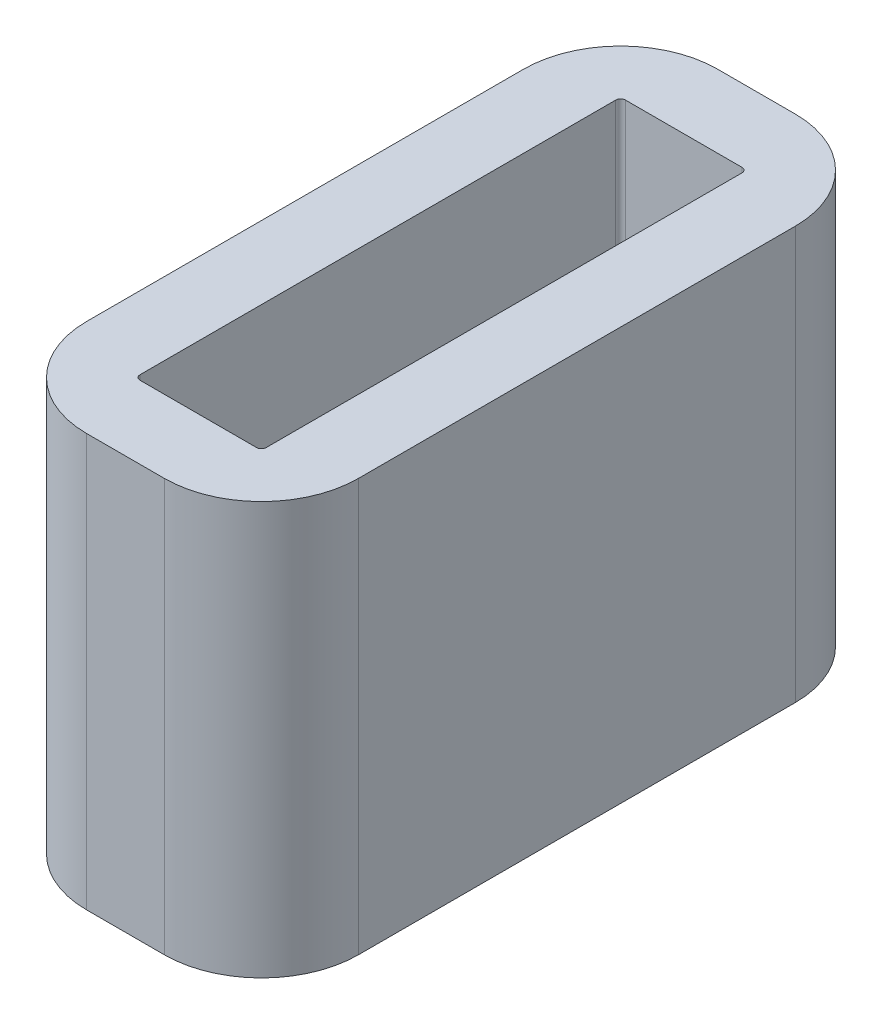
ISO-10303-21;
HEADER;
FILE_DESCRIPTION(('STEP AP214'),'2;1');
FILE_NAME('part.step','',(''),(''),'','','');
FILE_SCHEMA(('AUTOMOTIVE_DESIGN { 1 0 10303 214 1 1 1 1 }'));
ENDSEC;
DATA;
#1=APPLICATION_CONTEXT('core data for automotive mechanical design processes');
#2=APPLICATION_PROTOCOL_DEFINITION('international standard','automotive_design',2000,#1);
#3=PRODUCT_CONTEXT('',#1,'mechanical');
#4=PRODUCT('Part','Part','',(#3));
#5=PRODUCT_RELATED_PRODUCT_CATEGORY('part','',(#4));
#6=PRODUCT_DEFINITION_FORMATION('','',#4);
#7=PRODUCT_DEFINITION_CONTEXT('part definition',#1,'design');
#8=PRODUCT_DEFINITION('design','',#6,#7);
#9=PRODUCT_DEFINITION_SHAPE('','',#8);
#10=(LENGTH_UNIT() NAMED_UNIT(*) SI_UNIT(.MILLI.,.METRE.));
#11=(NAMED_UNIT(*) PLANE_ANGLE_UNIT() SI_UNIT($,.RADIAN.));
#12=(NAMED_UNIT(*) SI_UNIT($,.STERADIAN.) SOLID_ANGLE_UNIT());
#13=UNCERTAINTY_MEASURE_WITH_UNIT(LENGTH_MEASURE(1.E-05),#10,'distance_accuracy_value','');
#14=(GEOMETRIC_REPRESENTATION_CONTEXT(3) GLOBAL_UNCERTAINTY_ASSIGNED_CONTEXT((#13)) GLOBAL_UNIT_ASSIGNED_CONTEXT((#10,
#11,#12)) REPRESENTATION_CONTEXT('',''));
#15=CARTESIAN_POINT('',(0.,0.,0.));
#16=DIRECTION('',(0.,0.,1.));
#17=DIRECTION('',(1.,0.,0.));
#18=AXIS2_PLACEMENT_3D('',#15,#16,#17);
#19=CARTESIAN_POINT('',(88.2727928211845,88.0794752893805,-74.6093677585195));
#20=DIRECTION('',(0.,1.,0.));
#21=DIRECTION('',(0.,0.,1.));
#22=AXIS2_PLACEMENT_3D('',#19,#20,#21);
#23=CYLINDRICAL_SURFACE('',#22,1.99999999999999);
#24=CARTESIAN_POINT('',(88.2727928211845,96.5794752893805,-74.6093677585195));
#25=DIRECTION('',(0.,1.,0.));
#26=DIRECTION('',(0.,0.,-1.));
#27=AXIS2_PLACEMENT_3D('',#24,#25,#26);
#28=CIRCLE('',#27,1.99999999999999);
#29=CARTESIAN_POINT('',(86.2727928211845,96.5794752893805,-74.6093677585195));
#30=VERTEX_POINT('',#29);
#31=CARTESIAN_POINT('',(88.2727928211845,96.5794752893805,-72.6093677585195));
#32=VERTEX_POINT('',#31);
#33=EDGE_CURVE('E200',#30,#32,#28,.T.);
#34=ORIENTED_EDGE('',*,*,#33,.F.);
#35=DIRECTION('',(0.,1.,0.));
#36=VECTOR('',#35,1.);
#37=CARTESIAN_POINT('',(86.2727928211845,88.0794752893805,-74.6093677585195));
#38=LINE('',#37,#36);
#39=CARTESIAN_POINT('',(86.2727928211845,88.0794752893805,-74.6093677585195));
#40=VERTEX_POINT('',#39);
#41=EDGE_CURVE('E176',#40,#30,#38,.T.);
#42=ORIENTED_EDGE('',*,*,#41,.F.);
#43=CARTESIAN_POINT('',(88.2727928211845,88.0794752893805,-74.6093677585195));
#44=DIRECTION('',(0.,1.,0.));
#45=DIRECTION('',(0.,0.,-1.));
#46=AXIS2_PLACEMENT_3D('',#43,#44,#45);
#47=CIRCLE('',#46,1.99999999999999);
#48=CARTESIAN_POINT('',(88.2727928211845,88.0794752893805,-72.6093677585195));
#49=VERTEX_POINT('',#48);
#50=EDGE_CURVE('E170',#40,#49,#47,.T.);
#51=ORIENTED_EDGE('',*,*,#50,.T.);
#52=DIRECTION('',(0.,1.,0.));
#53=VECTOR('',#52,1.);
#54=CARTESIAN_POINT('',(88.2727928211845,88.0794752893805,-72.6093677585195));
#55=LINE('',#54,#53);
#56=EDGE_CURVE('E152',#49,#32,#55,.T.);
#57=ORIENTED_EDGE('',*,*,#56,.T.);
#58=EDGE_LOOP('',(#34,#42,#51,#57));
#59=FACE_BOUND('',#58,.T.);
#60=ADVANCED_FACE('F39',(#59),#23,.T.);
#61=CARTESIAN_POINT('',(86.2727928211845,88.0794752893805,-74.6093677585195));
#62=DIRECTION('',(-1.,0.,0.));
#63=DIRECTION('',(0.,0.,1.));
#64=AXIS2_PLACEMENT_3D('',#61,#62,#63);
#65=PLANE('',#64);
#66=DIRECTION('',(0.,0.,1.));
#67=VECTOR('',#66,1.);
#68=CARTESIAN_POINT('',(86.2727928211845,96.5794752893805,-74.6093677585195));
#69=LINE('',#68,#67);
#70=CARTESIAN_POINT('',(86.2727928211845,96.5794752893805,-83.6093677585195));
#71=VERTEX_POINT('',#70);
#72=EDGE_CURVE('E177',#71,#30,#69,.T.);
#73=ORIENTED_EDGE('',*,*,#72,.F.);
#74=DIRECTION('',(0.,1.,0.));
#75=VECTOR('',#74,1.);
#76=CARTESIAN_POINT('',(86.2727928211845,88.0794752893805,-83.6093677585195));
#77=LINE('',#76,#75);
#78=CARTESIAN_POINT('',(86.2727928211845,88.0794752893805,-83.6093677585195));
#79=VERTEX_POINT('',#78);
#80=EDGE_CURVE('E220',#79,#71,#77,.T.);
#81=ORIENTED_EDGE('',*,*,#80,.F.);
#82=DIRECTION('',(0.,0.,1.));
#83=VECTOR('',#82,1.);
#84=CARTESIAN_POINT('',(86.2727928211845,88.0794752893805,-74.6093677585195));
#85=LINE('',#84,#83);
#86=EDGE_CURVE('E163',#79,#40,#85,.T.);
#87=ORIENTED_EDGE('',*,*,#86,.T.);
#88=ORIENTED_EDGE('',*,*,#41,.T.);
#89=EDGE_LOOP('',(#73,#81,#87,#88));
#90=FACE_BOUND('',#89,.T.);
#91=ADVANCED_FACE('F320',(#90),#65,.T.);
#92=CARTESIAN_POINT('',(88.2727928211845,88.0794752893805,-83.6093677585195));
#93=DIRECTION('',(0.,1.,0.));
#94=DIRECTION('',(0.,0.,1.));
#95=AXIS2_PLACEMENT_3D('',#92,#93,#94);
#96=CYLINDRICAL_SURFACE('',#95,1.99999999999999);
#97=CARTESIAN_POINT('',(88.2727928211845,96.5794752893805,-83.6093677585195));
#98=DIRECTION('',(0.,1.,0.));
#99=DIRECTION('',(0.,0.,-1.));
#100=AXIS2_PLACEMENT_3D('',#97,#98,#99);
#101=CIRCLE('',#100,1.99999999999999);
#102=CARTESIAN_POINT('',(88.2727928211845,96.5794752893805,-85.6093677585195));
#103=VERTEX_POINT('',#102);
#104=EDGE_CURVE('E180',#103,#71,#101,.T.);
#105=ORIENTED_EDGE('',*,*,#104,.F.);
#106=DIRECTION('',(0.,1.,0.));
#107=VECTOR('',#106,1.);
#108=CARTESIAN_POINT('',(88.2727928211845,88.0794752893805,-85.6093677585195));
#109=LINE('',#108,#107);
#110=CARTESIAN_POINT('',(88.2727928211845,88.0794752893805,-85.6093677585195));
#111=VERTEX_POINT('',#110);
#112=EDGE_CURVE('E222',#111,#103,#109,.T.);
#113=ORIENTED_EDGE('',*,*,#112,.F.);
#114=CARTESIAN_POINT('',(88.2727928211845,88.0794752893805,-83.6093677585195));
#115=DIRECTION('',(0.,1.,0.));
#116=DIRECTION('',(0.,0.,-1.));
#117=AXIS2_PLACEMENT_3D('',#114,#115,#116);
#118=CIRCLE('',#117,1.99999999999999);
#119=EDGE_CURVE('E196',#111,#79,#118,.T.);
#120=ORIENTED_EDGE('',*,*,#119,.T.);
#121=ORIENTED_EDGE('',*,*,#80,.T.);
#122=EDGE_LOOP('',(#105,#113,#120,#121));
#123=FACE_BOUND('',#122,.T.);
#124=ADVANCED_FACE('F325',(#123),#96,.T.);
#125=CARTESIAN_POINT('',(88.2727928211845,88.0794752893805,-85.6093677585195));
#126=DIRECTION('',(0.,0.,-1.));
#127=DIRECTION('',(-1.,0.,0.));
#128=AXIS2_PLACEMENT_3D('',#125,#126,#127);
#129=PLANE('',#128);
#130=DIRECTION('',(-1.,0.,0.));
#131=VECTOR('',#130,1.);
#132=CARTESIAN_POINT('',(88.2727928211845,96.5794752893805,-85.6093677585195));
#133=LINE('',#132,#131);
#134=CARTESIAN_POINT('',(89.8727928211845,96.5794752893805,-85.6093677585195));
#135=VERTEX_POINT('',#134);
#136=EDGE_CURVE('E213',#135,#103,#133,.T.);
#137=ORIENTED_EDGE('',*,*,#136,.F.);
#138=DIRECTION('',(0.,1.,0.));
#139=VECTOR('',#138,1.);
#140=CARTESIAN_POINT('',(89.8727928211845,88.0794752893805,-85.6093677585195));
#141=LINE('',#140,#139);
#142=CARTESIAN_POINT('',(89.8727928211845,88.0794752893805,-85.6093677585195));
#143=VERTEX_POINT('',#142);
#144=EDGE_CURVE('E224',#143,#135,#141,.T.);
#145=ORIENTED_EDGE('',*,*,#144,.F.);
#146=DIRECTION('',(-1.,0.,0.));
#147=VECTOR('',#146,1.);
#148=CARTESIAN_POINT('',(88.2727928211845,88.0794752893805,-85.6093677585195));
#149=LINE('',#148,#147);
#150=EDGE_CURVE('E193',#143,#111,#149,.T.);
#151=ORIENTED_EDGE('',*,*,#150,.T.);
#152=ORIENTED_EDGE('',*,*,#112,.T.);
#153=EDGE_LOOP('',(#137,#145,#151,#152));
#154=FACE_BOUND('',#153,.T.);
#155=ADVANCED_FACE('F433',(#154),#129,.T.);
#156=CARTESIAN_POINT('',(89.8727928211845,88.0794752893805,-83.6093677585195));
#157=DIRECTION('',(0.,1.,0.));
#158=DIRECTION('',(0.,0.,1.));
#159=AXIS2_PLACEMENT_3D('',#156,#157,#158);
#160=CYLINDRICAL_SURFACE('',#159,1.99999999999999);
#161=CARTESIAN_POINT('',(89.8727928211845,96.5794752893805,-83.6093677585195));
#162=DIRECTION('',(0.,1.,0.));
#163=DIRECTION('',(0.,0.,-1.));
#164=AXIS2_PLACEMENT_3D('',#161,#162,#163);
#165=CIRCLE('',#164,1.99999999999999);
#166=CARTESIAN_POINT('',(91.8727928211845,96.5794752893805,-83.6093677585195));
#167=VERTEX_POINT('',#166);
#168=EDGE_CURVE('E210',#167,#135,#165,.T.);
#169=ORIENTED_EDGE('',*,*,#168,.F.);
#170=DIRECTION('',(0.,1.,0.));
#171=VECTOR('',#170,1.);
#172=CARTESIAN_POINT('',(91.8727928211845,88.0794752893805,-83.6093677585195));
#173=LINE('',#172,#171);
#174=CARTESIAN_POINT('',(91.8727928211845,88.0794752893805,-83.6093677585195));
#175=VERTEX_POINT('',#174);
#176=EDGE_CURVE('E226',#175,#167,#173,.T.);
#177=ORIENTED_EDGE('',*,*,#176,.F.);
#178=CARTESIAN_POINT('',(89.8727928211845,88.0794752893805,-83.6093677585195));
#179=DIRECTION('',(0.,1.,0.));
#180=DIRECTION('',(0.,0.,-1.));
#181=AXIS2_PLACEMENT_3D('',#178,#179,#180);
#182=CIRCLE('',#181,1.99999999999999);
#183=EDGE_CURVE('E190',#175,#143,#182,.T.);
#184=ORIENTED_EDGE('',*,*,#183,.T.);
#185=ORIENTED_EDGE('',*,*,#144,.T.);
#186=EDGE_LOOP('',(#169,#177,#184,#185));
#187=FACE_BOUND('',#186,.T.);
#188=ADVANCED_FACE('F423',(#187),#160,.T.);
#189=CARTESIAN_POINT('',(91.8727928211845,88.0794752893805,-74.6093677585195));
#190=DIRECTION('',(1.,0.,0.));
#191=DIRECTION('',(0.,0.,-1.));
#192=AXIS2_PLACEMENT_3D('',#189,#190,#191);
#193=PLANE('',#192);
#194=DIRECTION('',(0.,0.,-1.));
#195=VECTOR('',#194,1.);
#196=CARTESIAN_POINT('',(91.8727928211845,96.5794752893805,-74.6093677585195));
#197=LINE('',#196,#195);
#198=CARTESIAN_POINT('',(91.8727928211845,96.5794752893805,-74.6093677585195));
#199=VERTEX_POINT('',#198);
#200=EDGE_CURVE('E207',#199,#167,#197,.T.);
#201=ORIENTED_EDGE('',*,*,#200,.F.);
#202=DIRECTION('',(0.,1.,0.));
#203=VECTOR('',#202,1.);
#204=CARTESIAN_POINT('',(91.8727928211845,88.0794752893805,-74.6093677585195));
#205=LINE('',#204,#203);
#206=CARTESIAN_POINT('',(91.8727928211845,88.0794752893805,-74.6093677585195));
#207=VERTEX_POINT('',#206);
#208=EDGE_CURVE('E228',#207,#199,#205,.T.);
#209=ORIENTED_EDGE('',*,*,#208,.F.);
#210=DIRECTION('',(0.,0.,-1.));
#211=VECTOR('',#210,1.);
#212=CARTESIAN_POINT('',(91.8727928211845,88.0794752893805,-74.6093677585195));
#213=LINE('',#212,#211);
#214=EDGE_CURVE('E187',#207,#175,#213,.T.);
#215=ORIENTED_EDGE('',*,*,#214,.T.);
#216=ORIENTED_EDGE('',*,*,#176,.T.);
#217=EDGE_LOOP('',(#201,#209,#215,#216));
#218=FACE_BOUND('',#217,.T.);
#219=ADVANCED_FACE('F414',(#218),#193,.T.);
#220=CARTESIAN_POINT('',(89.8727928211845,88.0794752893805,-74.6093677585195));
#221=DIRECTION('',(0.,1.,0.));
#222=DIRECTION('',(0.,0.,1.));
#223=AXIS2_PLACEMENT_3D('',#220,#221,#222);
#224=CYLINDRICAL_SURFACE('',#223,1.99999999999999);
#225=CARTESIAN_POINT('',(89.8727928211845,96.5794752893805,-74.6093677585195));
#226=DIRECTION('',(0.,1.,0.));
#227=DIRECTION('',(0.,0.,1.));
#228=AXIS2_PLACEMENT_3D('',#225,#226,#227);
#229=CIRCLE('',#228,1.99999999999999);
#230=CARTESIAN_POINT('',(89.8727928211845,96.5794752893805,-72.6093677585195));
#231=VERTEX_POINT('',#230);
#232=EDGE_CURVE('E204',#231,#199,#229,.T.);
#233=ORIENTED_EDGE('',*,*,#232,.F.);
#234=DIRECTION('',(0.,1.,0.));
#235=VECTOR('',#234,1.);
#236=CARTESIAN_POINT('',(89.8727928211845,88.0794752893805,-72.6093677585195));
#237=LINE('',#236,#235);
#238=CARTESIAN_POINT('',(89.8727928211845,88.0794752893805,-72.6093677585195));
#239=VERTEX_POINT('',#238);
#240=EDGE_CURVE('E162',#239,#231,#237,.T.);
#241=ORIENTED_EDGE('',*,*,#240,.F.);
#242=CARTESIAN_POINT('',(89.8727928211845,88.0794752893805,-74.6093677585195));
#243=DIRECTION('',(0.,1.,0.));
#244=DIRECTION('',(0.,0.,1.));
#245=AXIS2_PLACEMENT_3D('',#242,#243,#244);
#246=CIRCLE('',#245,1.99999999999999);
#247=EDGE_CURVE('E174',#239,#207,#246,.T.);
#248=ORIENTED_EDGE('',*,*,#247,.T.);
#249=ORIENTED_EDGE('',*,*,#208,.T.);
#250=EDGE_LOOP('',(#233,#241,#248,#249));
#251=FACE_BOUND('',#250,.T.);
#252=ADVANCED_FACE('F406',(#251),#224,.T.);
#253=CARTESIAN_POINT('',(88.2727928211845,88.0794752893805,-72.6093677585195));
#254=DIRECTION('',(0.,0.,1.));
#255=DIRECTION('',(1.,0.,0.));
#256=AXIS2_PLACEMENT_3D('',#253,#254,#255);
#257=PLANE('',#256);
#258=DIRECTION('',(1.,0.,0.));
#259=VECTOR('',#258,1.);
#260=CARTESIAN_POINT('',(88.2727928211845,96.5794752893805,-72.6093677585195));
#261=LINE('',#260,#259);
#262=EDGE_CURVE('E157',#32,#231,#261,.T.);
#263=ORIENTED_EDGE('',*,*,#262,.F.);
#264=ORIENTED_EDGE('',*,*,#56,.F.);
#265=DIRECTION('',(1.,0.,0.));
#266=VECTOR('',#265,1.);
#267=CARTESIAN_POINT('',(88.2727928211845,88.0794752893805,-72.6093677585195));
#268=LINE('',#267,#266);
#269=EDGE_CURVE('E155',#49,#239,#268,.T.);
#270=ORIENTED_EDGE('',*,*,#269,.T.);
#271=ORIENTED_EDGE('',*,*,#240,.T.);
#272=EDGE_LOOP('',(#263,#264,#270,#271));
#273=FACE_BOUND('',#272,.T.);
#274=ADVANCED_FACE('F154',(#273),#257,.T.);
#275=CARTESIAN_POINT('',(88.2727928211845,88.0794752893805,-74.6093677585195));
#276=DIRECTION('',(0.,-1.,0.));
#277=DIRECTION('',(0.,0.,-1.));
#278=AXIS2_PLACEMENT_3D('',#275,#276,#277);
#279=PLANE('',#278);
#280=DIRECTION('',(1.,0.,0.));
#281=VECTOR('',#280,1.);
#282=CARTESIAN_POINT('',(87.7727928211845,88.0794752893805,-74.1093677585195));
#283=LINE('',#282,#281);
#284=CARTESIAN_POINT('',(87.8727928211845,88.0794752893805,-74.1093677585195));
#285=VERTEX_POINT('',#284);
#286=CARTESIAN_POINT('',(90.2727928211845,88.0794752893805,-74.1093677585195));
#287=VERTEX_POINT('',#286);
#288=EDGE_CURVE('E202',#285,#287,#283,.T.);
#289=ORIENTED_EDGE('',*,*,#288,.T.);
#290=CARTESIAN_POINT('',(90.2727928211845,88.0794752893805,-74.2093677585195));
#291=DIRECTION('',(0.,-1.,0.));
#292=DIRECTION('',(0.,0.,-1.));
#293=AXIS2_PLACEMENT_3D('',#290,#291,#292);
#294=CIRCLE('',#293,0.1);
#295=CARTESIAN_POINT('',(90.3727928211845,88.0794752893805,-74.2093677585195));
#296=VERTEX_POINT('',#295);
#297=EDGE_CURVE('E251',#287,#296,#294,.F.);
#298=ORIENTED_EDGE('',*,*,#297,.T.);
#299=DIRECTION('',(0.,0.,-1.));
#300=VECTOR('',#299,1.);
#301=CARTESIAN_POINT('',(90.3727928211845,88.0794752893805,-74.1093677585195));
#302=LINE('',#301,#300);
#303=CARTESIAN_POINT('',(90.3727928211845,88.0794752893805,-84.0093677585195));
#304=VERTEX_POINT('',#303);
#305=EDGE_CURVE('E280',#296,#304,#302,.T.);
#306=ORIENTED_EDGE('',*,*,#305,.T.);
#307=CARTESIAN_POINT('',(90.2727928211845,88.0794752893805,-84.0093677585195));
#308=DIRECTION('',(0.,-1.,0.));
#309=DIRECTION('',(0.,0.,-1.));
#310=AXIS2_PLACEMENT_3D('',#307,#308,#309);
#311=CIRCLE('',#310,0.1);
#312=CARTESIAN_POINT('',(90.2727928211845,88.0794752893805,-84.1093677585195));
#313=VERTEX_POINT('',#312);
#314=EDGE_CURVE('E11',#304,#313,#311,.F.);
#315=ORIENTED_EDGE('',*,*,#314,.T.);
#316=DIRECTION('',(-1.,0.,0.));
#317=VECTOR('',#316,1.);
#318=CARTESIAN_POINT('',(87.7727928211845,88.0794752893805,-84.1093677585195));
#319=LINE('',#318,#317);
#320=CARTESIAN_POINT('',(87.8727928211845,88.0794752893805,-84.1093677585195));
#321=VERTEX_POINT('',#320);
#322=EDGE_CURVE('E277',#313,#321,#319,.T.);
#323=ORIENTED_EDGE('',*,*,#322,.T.);
#324=CARTESIAN_POINT('',(87.8727928211845,88.0794752893805,-84.0093677585195));
#325=DIRECTION('',(0.,-1.,0.));
#326=DIRECTION('',(0.,0.,-1.));
#327=AXIS2_PLACEMENT_3D('',#324,#325,#326);
#328=CIRCLE('',#327,0.1);
#329=CARTESIAN_POINT('',(87.7727928211845,88.0794752893805,-84.0093677585195));
#330=VERTEX_POINT('',#329);
#331=EDGE_CURVE('E259',#321,#330,#328,.F.);
#332=ORIENTED_EDGE('',*,*,#331,.T.);
#333=DIRECTION('',(0.,0.,1.));
#334=VECTOR('',#333,1.);
#335=CARTESIAN_POINT('',(87.7727928211845,88.0794752893805,-74.1093677585195));
#336=LINE('',#335,#334);
#337=CARTESIAN_POINT('',(87.7727928211845,88.0794752893805,-74.2093677585195));
#338=VERTEX_POINT('',#337);
#339=EDGE_CURVE('E279',#330,#338,#336,.T.);
#340=ORIENTED_EDGE('',*,*,#339,.T.);
#341=CARTESIAN_POINT('',(87.8727928211845,88.0794752893805,-74.2093677585195));
#342=DIRECTION('',(0.,-1.,0.));
#343=DIRECTION('',(0.,0.,-1.));
#344=AXIS2_PLACEMENT_3D('',#341,#342,#343);
#345=CIRCLE('',#344,0.1);
#346=EDGE_CURVE('E255',#338,#285,#345,.F.);
#347=ORIENTED_EDGE('',*,*,#346,.T.);
#348=EDGE_LOOP('',(#289,#298,#306,#315,#323,#332,#340,#347));
#349=FACE_BOUND('',#348,.T.);
#350=ORIENTED_EDGE('',*,*,#50,.F.);
#351=ORIENTED_EDGE('',*,*,#86,.F.);
#352=ORIENTED_EDGE('',*,*,#119,.F.);
#353=ORIENTED_EDGE('',*,*,#150,.F.);
#354=ORIENTED_EDGE('',*,*,#183,.F.);
#355=ORIENTED_EDGE('',*,*,#214,.F.);
#356=ORIENTED_EDGE('',*,*,#247,.F.);
#357=ORIENTED_EDGE('',*,*,#269,.F.);
#358=EDGE_LOOP('',(#350,#351,#352,#353,#354,#355,#356,#357));
#359=FACE_BOUND('',#358,.T.);
#360=ADVANCED_FACE('F168',(#349,#359),#279,.T.);
#361=CARTESIAN_POINT('',(88.2727928211845,96.5794752893805,-74.6093677585195));
#362=DIRECTION('',(0.,-1.,0.));
#363=DIRECTION('',(0.,0.,-1.));
#364=AXIS2_PLACEMENT_3D('',#361,#362,#363);
#365=PLANE('',#364);
#366=DIRECTION('',(-1.,0.,0.));
#367=VECTOR('',#366,1.);
#368=CARTESIAN_POINT('',(87.7727928211845,96.5794752893805,-84.1093677585195));
#369=LINE('',#368,#367);
#370=CARTESIAN_POINT('',(90.2727928211845,96.5794752893805,-84.1093677585195));
#371=VERTEX_POINT('',#370);
#372=CARTESIAN_POINT('',(87.8727928211845,96.5794752893805,-84.1093677585195));
#373=VERTEX_POINT('',#372);
#374=EDGE_CURVE('E267',#371,#373,#369,.T.);
#375=ORIENTED_EDGE('',*,*,#374,.F.);
#376=CARTESIAN_POINT('',(90.2727928211845,96.5794752893805,-84.0093677585195));
#377=DIRECTION('',(0.,-1.,0.));
#378=DIRECTION('',(0.,0.,-1.));
#379=AXIS2_PLACEMENT_3D('',#376,#377,#378);
#380=CIRCLE('',#379,0.1);
#381=CARTESIAN_POINT('',(90.3727928211845,96.5794752893805,-84.0093677585195));
#382=VERTEX_POINT('',#381);
#383=EDGE_CURVE('E47',#371,#382,#380,.T.);
#384=ORIENTED_EDGE('',*,*,#383,.T.);
#385=DIRECTION('',(0.,0.,-1.));
#386=VECTOR('',#385,1.);
#387=CARTESIAN_POINT('',(90.3727928211845,96.5794752893805,-74.1093677585195));
#388=LINE('',#387,#386);
#389=CARTESIAN_POINT('',(90.3727928211845,96.5794752893805,-74.2093677585195));
#390=VERTEX_POINT('',#389);
#391=EDGE_CURVE('E266',#390,#382,#388,.T.);
#392=ORIENTED_EDGE('',*,*,#391,.F.);
#393=CARTESIAN_POINT('',(90.2727928211845,96.5794752893805,-74.2093677585195));
#394=DIRECTION('',(0.,-1.,0.));
#395=DIRECTION('',(0.,0.,-1.));
#396=AXIS2_PLACEMENT_3D('',#393,#394,#395);
#397=CIRCLE('',#396,0.1);
#398=CARTESIAN_POINT('',(90.2727928211845,96.5794752893805,-74.1093677585195));
#399=VERTEX_POINT('',#398);
#400=EDGE_CURVE('E249',#390,#399,#397,.T.);
#401=ORIENTED_EDGE('',*,*,#400,.T.);
#402=DIRECTION('',(1.,0.,0.));
#403=VECTOR('',#402,1.);
#404=CARTESIAN_POINT('',(87.7727928211845,96.5794752893805,-74.1093677585195));
#405=LINE('',#404,#403);
#406=CARTESIAN_POINT('',(87.8727928211845,96.5794752893805,-74.1093677585195));
#407=VERTEX_POINT('',#406);
#408=EDGE_CURVE('E183',#407,#399,#405,.T.);
#409=ORIENTED_EDGE('',*,*,#408,.F.);
#410=CARTESIAN_POINT('',(87.8727928211845,96.5794752893805,-74.2093677585195));
#411=DIRECTION('',(0.,-1.,0.));
#412=DIRECTION('',(0.,0.,-1.));
#413=AXIS2_PLACEMENT_3D('',#410,#411,#412);
#414=CIRCLE('',#413,0.1);
#415=CARTESIAN_POINT('',(87.7727928211845,96.5794752893805,-74.2093677585195));
#416=VERTEX_POINT('',#415);
#417=EDGE_CURVE('E253',#407,#416,#414,.T.);
#418=ORIENTED_EDGE('',*,*,#417,.T.);
#419=DIRECTION('',(0.,0.,1.));
#420=VECTOR('',#419,1.);
#421=CARTESIAN_POINT('',(87.7727928211845,96.5794752893805,-74.1093677585195));
#422=LINE('',#421,#420);
#423=CARTESIAN_POINT('',(87.7727928211845,96.5794752893805,-84.0093677585195));
#424=VERTEX_POINT('',#423);
#425=EDGE_CURVE('E288',#424,#416,#422,.T.);
#426=ORIENTED_EDGE('',*,*,#425,.F.);
#427=CARTESIAN_POINT('',(87.8727928211845,96.5794752893805,-84.0093677585195));
#428=DIRECTION('',(0.,-1.,0.));
#429=DIRECTION('',(0.,0.,-1.));
#430=AXIS2_PLACEMENT_3D('',#427,#428,#429);
#431=CIRCLE('',#430,0.1);
#432=EDGE_CURVE('E257',#424,#373,#431,.T.);
#433=ORIENTED_EDGE('',*,*,#432,.T.);
#434=EDGE_LOOP('',(#375,#384,#392,#401,#409,#418,#426,#433));
#435=FACE_BOUND('',#434,.T.);
#436=ORIENTED_EDGE('',*,*,#33,.T.);
#437=ORIENTED_EDGE('',*,*,#262,.T.);
#438=ORIENTED_EDGE('',*,*,#232,.T.);
#439=ORIENTED_EDGE('',*,*,#200,.T.);
#440=ORIENTED_EDGE('',*,*,#168,.T.);
#441=ORIENTED_EDGE('',*,*,#136,.T.);
#442=ORIENTED_EDGE('',*,*,#104,.T.);
#443=ORIENTED_EDGE('',*,*,#72,.T.);
#444=EDGE_LOOP('',(#436,#437,#438,#439,#440,#441,#442,#443));
#445=FACE_BOUND('',#444,.T.);
#446=ADVANCED_FACE('F264',(#435,#445),#365,.F.);
#447=CARTESIAN_POINT('',(90.3727928211845,88.0794752893805,-74.1093677585195));
#448=DIRECTION('',(1.,0.,0.));
#449=DIRECTION('',(0.,0.,-1.));
#450=AXIS2_PLACEMENT_3D('',#447,#448,#449);
#451=PLANE('',#450);
#452=ORIENTED_EDGE('',*,*,#305,.F.);
#453=DIRECTION('',(0.,1.,0.));
#454=VECTOR('',#453,1.);
#455=CARTESIAN_POINT('',(90.3727928211845,96.5794752893805,-74.2093677585195));
#456=LINE('',#455,#454);
#457=EDGE_CURVE('E232',#296,#390,#456,.T.);
#458=ORIENTED_EDGE('',*,*,#457,.T.);
#459=ORIENTED_EDGE('',*,*,#391,.T.);
#460=DIRECTION('',(0.,1.,0.));
#461=VECTOR('',#460,1.);
#462=CARTESIAN_POINT('',(90.3727928211845,88.0794752893805,-84.0093677585195));
#463=LINE('',#462,#461);
#464=EDGE_CURVE('E219',#382,#304,#463,.F.);
#465=ORIENTED_EDGE('',*,*,#464,.T.);
#466=EDGE_LOOP('',(#452,#458,#459,#465));
#467=FACE_BOUND('',#466,.T.);
#468=ADVANCED_FACE('F273',(#467),#451,.F.);
#469=CARTESIAN_POINT('',(87.7727928211845,88.0794752893805,-74.1093677585195));
#470=DIRECTION('',(0.,0.,1.));
#471=DIRECTION('',(1.,0.,0.));
#472=AXIS2_PLACEMENT_3D('',#469,#470,#471);
#473=PLANE('',#472);
#474=ORIENTED_EDGE('',*,*,#408,.T.);
#475=DIRECTION('',(0.,1.,0.));
#476=VECTOR('',#475,1.);
#477=CARTESIAN_POINT('',(90.2727928211845,88.0794752893805,-74.1093677585195));
#478=LINE('',#477,#476);
#479=EDGE_CURVE('E238',#399,#287,#478,.F.);
#480=ORIENTED_EDGE('',*,*,#479,.T.);
#481=ORIENTED_EDGE('',*,*,#288,.F.);
#482=DIRECTION('',(0.,1.,0.));
#483=VECTOR('',#482,1.);
#484=CARTESIAN_POINT('',(87.8727928211845,96.5794752893805,-74.1093677585195));
#485=LINE('',#484,#483);
#486=EDGE_CURVE('E235',#285,#407,#485,.T.);
#487=ORIENTED_EDGE('',*,*,#486,.T.);
#488=EDGE_LOOP('',(#474,#480,#481,#487));
#489=FACE_BOUND('',#488,.T.);
#490=ADVANCED_FACE('F297',(#489),#473,.F.);
#491=CARTESIAN_POINT('',(87.7727928211845,88.0794752893805,-74.1093677585195));
#492=DIRECTION('',(-1.,0.,0.));
#493=DIRECTION('',(0.,0.,1.));
#494=AXIS2_PLACEMENT_3D('',#491,#492,#493);
#495=PLANE('',#494);
#496=ORIENTED_EDGE('',*,*,#425,.T.);
#497=DIRECTION('',(0.,1.,0.));
#498=VECTOR('',#497,1.);
#499=CARTESIAN_POINT('',(87.7727928211845,88.0794752893805,-74.2093677585195));
#500=LINE('',#499,#498);
#501=EDGE_CURVE('E243',#416,#338,#500,.F.);
#502=ORIENTED_EDGE('',*,*,#501,.T.);
#503=ORIENTED_EDGE('',*,*,#339,.F.);
#504=DIRECTION('',(0.,1.,0.));
#505=VECTOR('',#504,1.);
#506=CARTESIAN_POINT('',(87.7727928211845,96.5794752893805,-84.0093677585195));
#507=LINE('',#506,#505);
#508=EDGE_CURVE('E240',#330,#424,#507,.T.);
#509=ORIENTED_EDGE('',*,*,#508,.T.);
#510=EDGE_LOOP('',(#496,#502,#503,#509));
#511=FACE_BOUND('',#510,.T.);
#512=ADVANCED_FACE('F310',(#511),#495,.F.);
#513=CARTESIAN_POINT('',(87.7727928211845,88.0794752893805,-84.1093677585195));
#514=DIRECTION('',(0.,0.,-1.));
#515=DIRECTION('',(-1.,0.,0.));
#516=AXIS2_PLACEMENT_3D('',#513,#514,#515);
#517=PLANE('',#516);
#518=ORIENTED_EDGE('',*,*,#374,.T.);
#519=DIRECTION('',(0.,1.,0.));
#520=VECTOR('',#519,1.);
#521=CARTESIAN_POINT('',(87.8727928211845,88.0794752893805,-84.1093677585195));
#522=LINE('',#521,#520);
#523=EDGE_CURVE('E54',#373,#321,#522,.F.);
#524=ORIENTED_EDGE('',*,*,#523,.T.);
#525=ORIENTED_EDGE('',*,*,#322,.F.);
#526=DIRECTION('',(0.,1.,0.));
#527=VECTOR('',#526,1.);
#528=CARTESIAN_POINT('',(90.2727928211845,96.5794752893805,-84.1093677585195));
#529=LINE('',#528,#527);
#530=EDGE_CURVE('E245',#313,#371,#529,.T.);
#531=ORIENTED_EDGE('',*,*,#530,.T.);
#532=EDGE_LOOP('',(#518,#524,#525,#531));
#533=FACE_BOUND('',#532,.T.);
#534=ADVANCED_FACE('F276',(#533),#517,.F.);
#535=CARTESIAN_POINT('',(90.2727928211845,88.0794752893805,-74.2093677585195));
#536=DIRECTION('',(0.,-1.,0.));
#537=DIRECTION('',(0.,0.,-1.));
#538=AXIS2_PLACEMENT_3D('',#535,#536,#537);
#539=CYLINDRICAL_SURFACE('',#538,0.1);
#540=ORIENTED_EDGE('',*,*,#297,.F.);
#541=ORIENTED_EDGE('',*,*,#479,.F.);
#542=ORIENTED_EDGE('',*,*,#400,.F.);
#543=ORIENTED_EDGE('',*,*,#457,.F.);
#544=EDGE_LOOP('',(#540,#541,#542,#543));
#545=FACE_BOUND('',#544,.T.);
#546=ADVANCED_FACE('F302',(#545),#539,.F.);
#547=CARTESIAN_POINT('',(87.8727928211845,88.0794752893805,-74.2093677585195));
#548=DIRECTION('',(0.,-1.,0.));
#549=DIRECTION('',(0.,0.,-1.));
#550=AXIS2_PLACEMENT_3D('',#547,#548,#549);
#551=CYLINDRICAL_SURFACE('',#550,0.1);
#552=ORIENTED_EDGE('',*,*,#346,.F.);
#553=ORIENTED_EDGE('',*,*,#501,.F.);
#554=ORIENTED_EDGE('',*,*,#417,.F.);
#555=ORIENTED_EDGE('',*,*,#486,.F.);
#556=EDGE_LOOP('',(#552,#553,#554,#555));
#557=FACE_BOUND('',#556,.T.);
#558=ADVANCED_FACE('F305',(#557),#551,.F.);
#559=CARTESIAN_POINT('',(87.8727928211845,88.0794752893805,-84.0093677585195));
#560=DIRECTION('',(0.,-1.,0.));
#561=DIRECTION('',(0.,0.,-1.));
#562=AXIS2_PLACEMENT_3D('',#559,#560,#561);
#563=CYLINDRICAL_SURFACE('',#562,0.1);
#564=ORIENTED_EDGE('',*,*,#331,.F.);
#565=ORIENTED_EDGE('',*,*,#523,.F.);
#566=ORIENTED_EDGE('',*,*,#432,.F.);
#567=ORIENTED_EDGE('',*,*,#508,.F.);
#568=EDGE_LOOP('',(#564,#565,#566,#567));
#569=FACE_BOUND('',#568,.T.);
#570=ADVANCED_FACE('F308',(#569),#563,.F.);
#571=CARTESIAN_POINT('',(90.2727928211845,88.0794752893805,-84.0093677585195));
#572=DIRECTION('',(0.,-1.,0.));
#573=DIRECTION('',(0.,0.,-1.));
#574=AXIS2_PLACEMENT_3D('',#571,#572,#573);
#575=CYLINDRICAL_SURFACE('',#574,0.1);
#576=ORIENTED_EDGE('',*,*,#314,.F.);
#577=ORIENTED_EDGE('',*,*,#464,.F.);
#578=ORIENTED_EDGE('',*,*,#383,.F.);
#579=ORIENTED_EDGE('',*,*,#530,.F.);
#580=EDGE_LOOP('',(#576,#577,#578,#579));
#581=FACE_BOUND('',#580,.T.);
#582=ADVANCED_FACE('F41',(#581),#575,.F.);
#583=CLOSED_SHELL('',(#60,#91,#124,#155,#188,#219,#252,#274,#360,#446,#468,#490,#512,#534,#546,
#558,#570,#582));
#584=MANIFOLD_SOLID_BREP('B2',#583);
#585=ADVANCED_BREP_SHAPE_REPRESENTATION('',(#18,#584),#14);
#586=SHAPE_DEFINITION_REPRESENTATION(#9,#585);
ENDSEC;
END-ISO-10303-21;
